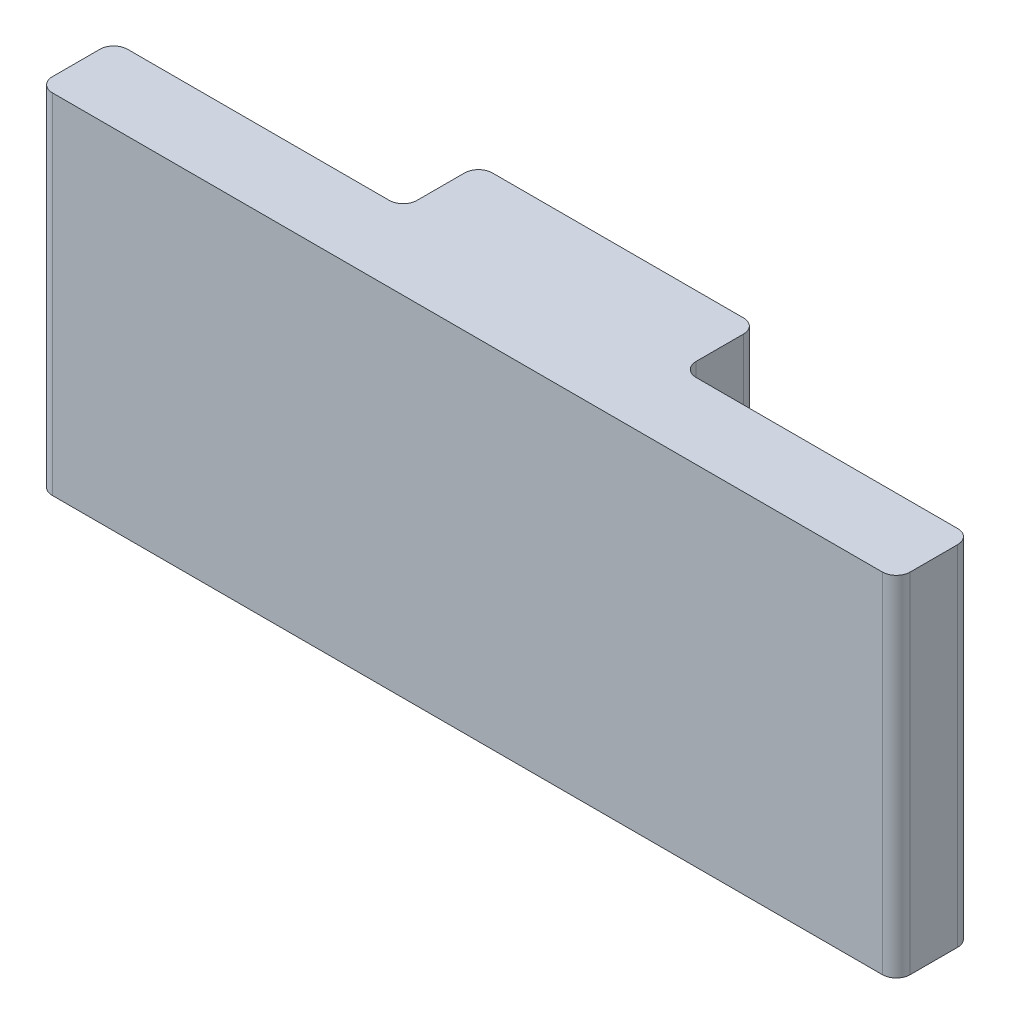
ISO-10303-21;
HEADER;
FILE_DESCRIPTION(('STEP AP214'),'2;1');
FILE_NAME('part.step','',(''),(''),'','','');
FILE_SCHEMA(('AUTOMOTIVE_DESIGN { 1 0 10303 214 1 1 1 1 }'));
ENDSEC;
DATA;
#1=APPLICATION_CONTEXT('core data for automotive mechanical design processes');
#2=APPLICATION_PROTOCOL_DEFINITION('international standard','automotive_design',2000,#1);
#3=PRODUCT_CONTEXT('',#1,'mechanical');
#4=PRODUCT('Part','Part','',(#3));
#5=PRODUCT_RELATED_PRODUCT_CATEGORY('part','',(#4));
#6=PRODUCT_DEFINITION_FORMATION('','',#4);
#7=PRODUCT_DEFINITION_CONTEXT('part definition',#1,'design');
#8=PRODUCT_DEFINITION('design','',#6,#7);
#9=PRODUCT_DEFINITION_SHAPE('','',#8);
#10=(LENGTH_UNIT() NAMED_UNIT(*) SI_UNIT(.MILLI.,.METRE.));
#11=(NAMED_UNIT(*) PLANE_ANGLE_UNIT() SI_UNIT($,.RADIAN.));
#12=(NAMED_UNIT(*) SI_UNIT($,.STERADIAN.) SOLID_ANGLE_UNIT());
#13=UNCERTAINTY_MEASURE_WITH_UNIT(LENGTH_MEASURE(1.E-05),#10,'distance_accuracy_value','');
#14=(GEOMETRIC_REPRESENTATION_CONTEXT(3) GLOBAL_UNCERTAINTY_ASSIGNED_CONTEXT((#13)) GLOBAL_UNIT_ASSIGNED_CONTEXT((#10,
#11,#12)) REPRESENTATION_CONTEXT('',''));
#15=CARTESIAN_POINT('',(0.,0.,0.));
#16=DIRECTION('',(0.,0.,1.));
#17=DIRECTION('',(1.,0.,0.));
#18=AXIS2_PLACEMENT_3D('',#15,#16,#17);
#19=CARTESIAN_POINT('',(297.5,250.,-10.));
#20=DIRECTION('',(0.,-1.,0.));
#21=DIRECTION('',(0.,0.,-1.));
#22=AXIS2_PLACEMENT_3D('',#19,#20,#21);
#23=CYLINDRICAL_SURFACE('',#22,10.);
#24=CARTESIAN_POINT('',(297.5,0.,-10.));
#25=DIRECTION('',(0.,1.,0.));
#26=DIRECTION('',(0.,0.,1.));
#27=AXIS2_PLACEMENT_3D('',#24,#25,#26);
#28=CIRCLE('',#27,10.);
#29=CARTESIAN_POINT('',(297.5,0.,0.));
#30=VERTEX_POINT('',#29);
#31=CARTESIAN_POINT('',(307.5,0.,-10.0000000000001));
#32=VERTEX_POINT('',#31);
#33=EDGE_CURVE('E181',#30,#32,#28,.T.);
#34=ORIENTED_EDGE('',*,*,#33,.T.);
#35=DIRECTION('',(0.,-1.,0.));
#36=VECTOR('',#35,1.);
#37=CARTESIAN_POINT('',(307.5,250.,-10.0000000000001));
#38=LINE('',#37,#36);
#39=CARTESIAN_POINT('',(307.5,250.,-10.0000000000001));
#40=VERTEX_POINT('',#39);
#41=EDGE_CURVE('E11',#40,#32,#38,.T.);
#42=ORIENTED_EDGE('',*,*,#41,.F.);
#43=CARTESIAN_POINT('',(297.5,250.,-10.));
#44=DIRECTION('',(0.,1.,0.));
#45=DIRECTION('',(0.,0.,1.));
#46=AXIS2_PLACEMENT_3D('',#43,#44,#45);
#47=CIRCLE('',#46,10.);
#48=CARTESIAN_POINT('',(297.5,250.,0.));
#49=VERTEX_POINT('',#48);
#50=EDGE_CURVE('E211',#49,#40,#47,.T.);
#51=ORIENTED_EDGE('',*,*,#50,.F.);
#52=DIRECTION('',(0.,-1.,0.));
#53=VECTOR('',#52,1.);
#54=CARTESIAN_POINT('',(297.5,250.,0.));
#55=LINE('',#54,#53);
#56=EDGE_CURVE('E177',#49,#30,#55,.T.);
#57=ORIENTED_EDGE('',*,*,#56,.T.);
#58=EDGE_LOOP('',(#34,#42,#51,#57));
#59=FACE_BOUND('',#58,.T.);
#60=ADVANCED_FACE('F37',(#59),#23,.T.);
#61=CARTESIAN_POINT('',(307.5,250.,-10.0000000000001));
#62=DIRECTION('',(-1.,0.,0.));
#63=DIRECTION('',(0.,0.,1.));
#64=AXIS2_PLACEMENT_3D('',#61,#62,#63);
#65=PLANE('',#64);
#66=DIRECTION('',(0.,0.,-1.));
#67=VECTOR('',#66,1.);
#68=CARTESIAN_POINT('',(307.5,0.,-10.0000000000001));
#69=LINE('',#68,#67);
#70=CARTESIAN_POINT('',(307.5,0.,-43.9999999999999));
#71=VERTEX_POINT('',#70);
#72=EDGE_CURVE('E184',#32,#71,#69,.T.);
#73=ORIENTED_EDGE('',*,*,#72,.T.);
#74=DIRECTION('',(0.,-1.,0.));
#75=VECTOR('',#74,1.);
#76=CARTESIAN_POINT('',(307.5,250.,-43.9999999999999));
#77=LINE('',#76,#75);
#78=CARTESIAN_POINT('',(307.5,250.,-43.9999999999999));
#79=VERTEX_POINT('',#78);
#80=EDGE_CURVE('E45',#79,#71,#77,.T.);
#81=ORIENTED_EDGE('',*,*,#80,.F.);
#82=DIRECTION('',(0.,0.,-1.));
#83=VECTOR('',#82,1.);
#84=CARTESIAN_POINT('',(307.5,250.,-10.0000000000001));
#85=LINE('',#84,#83);
#86=EDGE_CURVE('E120',#40,#79,#85,.T.);
#87=ORIENTED_EDGE('',*,*,#86,.F.);
#88=ORIENTED_EDGE('',*,*,#41,.T.);
#89=EDGE_LOOP('',(#73,#81,#87,#88));
#90=FACE_BOUND('',#89,.T.);
#91=ADVANCED_FACE('F309',(#90),#65,.F.);
#92=CARTESIAN_POINT('',(297.5,250.,-44.));
#93=DIRECTION('',(0.,-1.,0.));
#94=DIRECTION('',(0.,0.,-1.));
#95=AXIS2_PLACEMENT_3D('',#92,#93,#94);
#96=CYLINDRICAL_SURFACE('',#95,10.);
#97=CARTESIAN_POINT('',(297.5,0.,-44.));
#98=DIRECTION('',(0.,1.,0.));
#99=DIRECTION('',(0.,0.,1.));
#100=AXIS2_PLACEMENT_3D('',#97,#98,#99);
#101=CIRCLE('',#100,10.);
#102=CARTESIAN_POINT('',(297.5,0.,-54.));
#103=VERTEX_POINT('',#102);
#104=EDGE_CURVE('E186',#71,#103,#101,.T.);
#105=ORIENTED_EDGE('',*,*,#104,.T.);
#106=DIRECTION('',(0.,-1.,0.));
#107=VECTOR('',#106,1.);
#108=CARTESIAN_POINT('',(297.5,250.,-54.));
#109=LINE('',#108,#107);
#110=CARTESIAN_POINT('',(297.5,250.,-54.));
#111=VERTEX_POINT('',#110);
#112=EDGE_CURVE('E242',#111,#103,#109,.T.);
#113=ORIENTED_EDGE('',*,*,#112,.F.);
#114=CARTESIAN_POINT('',(297.5,250.,-44.));
#115=DIRECTION('',(0.,1.,0.));
#116=DIRECTION('',(0.,0.,1.));
#117=AXIS2_PLACEMENT_3D('',#114,#115,#116);
#118=CIRCLE('',#117,10.);
#119=EDGE_CURVE('E250',#79,#111,#118,.T.);
#120=ORIENTED_EDGE('',*,*,#119,.F.);
#121=ORIENTED_EDGE('',*,*,#80,.T.);
#122=EDGE_LOOP('',(#105,#113,#120,#121));
#123=FACE_BOUND('',#122,.T.);
#124=ADVANCED_FACE('F248',(#123),#96,.T.);
#125=CARTESIAN_POINT('',(110.,250.,-54.));
#126=DIRECTION('',(0.,0.,1.));
#127=DIRECTION('',(1.,0.,0.));
#128=AXIS2_PLACEMENT_3D('',#125,#126,#127);
#129=PLANE('',#128);
#130=DIRECTION('',(-1.,0.,0.));
#131=VECTOR('',#130,1.);
#132=CARTESIAN_POINT('',(110.,0.,-54.));
#133=LINE('',#132,#131);
#134=CARTESIAN_POINT('',(110.,0.,-54.));
#135=VERTEX_POINT('',#134);
#136=EDGE_CURVE('E188',#103,#135,#133,.T.);
#137=ORIENTED_EDGE('',*,*,#136,.T.);
#138=DIRECTION('',(0.,-1.,0.));
#139=VECTOR('',#138,1.);
#140=CARTESIAN_POINT('',(110.,250.,-54.));
#141=LINE('',#140,#139);
#142=CARTESIAN_POINT('',(110.,250.,-54.));
#143=VERTEX_POINT('',#142);
#144=EDGE_CURVE('E239',#143,#135,#141,.T.);
#145=ORIENTED_EDGE('',*,*,#144,.F.);
#146=DIRECTION('',(-1.,0.,0.));
#147=VECTOR('',#146,1.);
#148=CARTESIAN_POINT('',(110.,250.,-54.));
#149=LINE('',#148,#147);
#150=EDGE_CURVE('E268',#111,#143,#149,.T.);
#151=ORIENTED_EDGE('',*,*,#150,.F.);
#152=ORIENTED_EDGE('',*,*,#112,.T.);
#153=EDGE_LOOP('',(#137,#145,#151,#152));
#154=FACE_BOUND('',#153,.T.);
#155=ADVANCED_FACE('F259',(#154),#129,.F.);
#156=CARTESIAN_POINT('',(110.,250.,-64.));
#157=DIRECTION('',(0.,-1.,0.));
#158=DIRECTION('',(0.,0.,-1.));
#159=AXIS2_PLACEMENT_3D('',#156,#157,#158);
#160=CYLINDRICAL_SURFACE('',#159,10.);
#161=CARTESIAN_POINT('',(110.,0.,-64.));
#162=DIRECTION('',(0.,-1.,0.));
#163=DIRECTION('',(0.,0.,1.));
#164=AXIS2_PLACEMENT_3D('',#161,#162,#163);
#165=CIRCLE('',#164,10.);
#166=CARTESIAN_POINT('',(100.,0.,-64.0000000000001));
#167=VERTEX_POINT('',#166);
#168=EDGE_CURVE('E190',#135,#167,#165,.T.);
#169=ORIENTED_EDGE('',*,*,#168,.T.);
#170=DIRECTION('',(0.,-1.,0.));
#171=VECTOR('',#170,1.);
#172=CARTESIAN_POINT('',(100.,250.,-64.0000000000001));
#173=LINE('',#172,#171);
#174=CARTESIAN_POINT('',(100.,250.,-64.0000000000001));
#175=VERTEX_POINT('',#174);
#176=EDGE_CURVE('E236',#175,#167,#173,.T.);
#177=ORIENTED_EDGE('',*,*,#176,.F.);
#178=CARTESIAN_POINT('',(110.,250.,-64.));
#179=DIRECTION('',(0.,-1.,0.));
#180=DIRECTION('',(0.,0.,1.));
#181=AXIS2_PLACEMENT_3D('',#178,#179,#180);
#182=CIRCLE('',#181,10.);
#183=EDGE_CURVE('E265',#143,#175,#182,.T.);
#184=ORIENTED_EDGE('',*,*,#183,.F.);
#185=ORIENTED_EDGE('',*,*,#144,.T.);
#186=EDGE_LOOP('',(#169,#177,#184,#185));
#187=FACE_BOUND('',#186,.T.);
#188=ADVANCED_FACE('F263',(#187),#160,.F.);
#189=CARTESIAN_POINT('',(100.,250.,-97.9999999999999));
#190=DIRECTION('',(-1.,0.,0.));
#191=DIRECTION('',(0.,0.,1.));
#192=AXIS2_PLACEMENT_3D('',#189,#190,#191);
#193=PLANE('',#192);
#194=DIRECTION('',(0.,0.,-1.));
#195=VECTOR('',#194,1.);
#196=CARTESIAN_POINT('',(100.,0.,-97.9999999999999));
#197=LINE('',#196,#195);
#198=CARTESIAN_POINT('',(100.,0.,-97.9999999999999));
#199=VERTEX_POINT('',#198);
#200=EDGE_CURVE('E192',#167,#199,#197,.T.);
#201=ORIENTED_EDGE('',*,*,#200,.T.);
#202=DIRECTION('',(0.,-1.,0.));
#203=VECTOR('',#202,1.);
#204=CARTESIAN_POINT('',(100.,250.,-97.9999999999999));
#205=LINE('',#204,#203);
#206=CARTESIAN_POINT('',(100.,250.,-97.9999999999999));
#207=VERTEX_POINT('',#206);
#208=EDGE_CURVE('E233',#207,#199,#205,.T.);
#209=ORIENTED_EDGE('',*,*,#208,.F.);
#210=DIRECTION('',(0.,0.,-1.));
#211=VECTOR('',#210,1.);
#212=CARTESIAN_POINT('',(100.,250.,-97.9999999999999));
#213=LINE('',#212,#211);
#214=EDGE_CURVE('E267',#175,#207,#213,.T.);
#215=ORIENTED_EDGE('',*,*,#214,.F.);
#216=ORIENTED_EDGE('',*,*,#176,.T.);
#217=EDGE_LOOP('',(#201,#209,#215,#216));
#218=FACE_BOUND('',#217,.T.);
#219=ADVANCED_FACE('F322',(#218),#193,.F.);
#220=CARTESIAN_POINT('',(90.,250.,-98.));
#221=DIRECTION('',(0.,-1.,0.));
#222=DIRECTION('',(0.,0.,-1.));
#223=AXIS2_PLACEMENT_3D('',#220,#221,#222);
#224=CYLINDRICAL_SURFACE('',#223,9.99999999999999);
#225=CARTESIAN_POINT('',(90.,0.,-98.));
#226=DIRECTION('',(0.,1.,0.));
#227=DIRECTION('',(0.,0.,-1.));
#228=AXIS2_PLACEMENT_3D('',#225,#226,#227);
#229=CIRCLE('',#228,9.99999999999999);
#230=CARTESIAN_POINT('',(89.9999999999999,0.,-108.));
#231=VERTEX_POINT('',#230);
#232=EDGE_CURVE('E194',#199,#231,#229,.T.);
#233=ORIENTED_EDGE('',*,*,#232,.T.);
#234=DIRECTION('',(0.,-1.,0.));
#235=VECTOR('',#234,1.);
#236=CARTESIAN_POINT('',(89.9999999999999,250.,-108.));
#237=LINE('',#236,#235);
#238=CARTESIAN_POINT('',(89.9999999999999,250.,-108.));
#239=VERTEX_POINT('',#238);
#240=EDGE_CURVE('E230',#239,#231,#237,.T.);
#241=ORIENTED_EDGE('',*,*,#240,.F.);
#242=CARTESIAN_POINT('',(90.,250.,-98.));
#243=DIRECTION('',(0.,1.,0.));
#244=DIRECTION('',(0.,0.,-1.));
#245=AXIS2_PLACEMENT_3D('',#242,#243,#244);
#246=CIRCLE('',#245,9.99999999999999);
#247=EDGE_CURVE('E270',#207,#239,#246,.T.);
#248=ORIENTED_EDGE('',*,*,#247,.F.);
#249=ORIENTED_EDGE('',*,*,#208,.T.);
#250=EDGE_LOOP('',(#233,#241,#248,#249));
#251=FACE_BOUND('',#250,.T.);
#252=ADVANCED_FACE('F325',(#251),#224,.T.);
#253=CARTESIAN_POINT('',(-89.9999999999999,250.,-108.));
#254=DIRECTION('',(0.,0.,1.));
#255=DIRECTION('',(1.,0.,0.));
#256=AXIS2_PLACEMENT_3D('',#253,#254,#255);
#257=PLANE('',#256);
#258=DIRECTION('',(-1.,0.,0.));
#259=VECTOR('',#258,1.);
#260=CARTESIAN_POINT('',(-89.9999999999999,0.,-108.));
#261=LINE('',#260,#259);
#262=CARTESIAN_POINT('',(-89.9999999999999,0.,-108.));
#263=VERTEX_POINT('',#262);
#264=EDGE_CURVE('E196',#231,#263,#261,.T.);
#265=ORIENTED_EDGE('',*,*,#264,.T.);
#266=DIRECTION('',(0.,-1.,0.));
#267=VECTOR('',#266,1.);
#268=CARTESIAN_POINT('',(-89.9999999999999,250.,-108.));
#269=LINE('',#268,#267);
#270=CARTESIAN_POINT('',(-89.9999999999999,250.,-108.));
#271=VERTEX_POINT('',#270);
#272=EDGE_CURVE('E227',#271,#263,#269,.T.);
#273=ORIENTED_EDGE('',*,*,#272,.F.);
#274=DIRECTION('',(-1.,0.,0.));
#275=VECTOR('',#274,1.);
#276=CARTESIAN_POINT('',(-89.9999999999999,250.,-108.));
#277=LINE('',#276,#275);
#278=EDGE_CURVE('E276',#239,#271,#277,.T.);
#279=ORIENTED_EDGE('',*,*,#278,.F.);
#280=ORIENTED_EDGE('',*,*,#240,.T.);
#281=EDGE_LOOP('',(#265,#273,#279,#280));
#282=FACE_BOUND('',#281,.T.);
#283=ADVANCED_FACE('F329',(#282),#257,.F.);
#284=CARTESIAN_POINT('',(-90.,250.,-98.));
#285=DIRECTION('',(0.,-1.,0.));
#286=DIRECTION('',(0.,0.,-1.));
#287=AXIS2_PLACEMENT_3D('',#284,#285,#286);
#288=CYLINDRICAL_SURFACE('',#287,9.99999999999999);
#289=CARTESIAN_POINT('',(-90.,0.,-98.));
#290=DIRECTION('',(0.,1.,0.));
#291=DIRECTION('',(0.,0.,1.));
#292=AXIS2_PLACEMENT_3D('',#289,#290,#291);
#293=CIRCLE('',#292,9.99999999999999);
#294=CARTESIAN_POINT('',(-100.,0.,-97.9999999999999));
#295=VERTEX_POINT('',#294);
#296=EDGE_CURVE('E198',#263,#295,#293,.T.);
#297=ORIENTED_EDGE('',*,*,#296,.T.);
#298=DIRECTION('',(0.,-1.,0.));
#299=VECTOR('',#298,1.);
#300=CARTESIAN_POINT('',(-100.,250.,-97.9999999999999));
#301=LINE('',#300,#299);
#302=CARTESIAN_POINT('',(-100.,250.,-97.9999999999999));
#303=VERTEX_POINT('',#302);
#304=EDGE_CURVE('E224',#303,#295,#301,.T.);
#305=ORIENTED_EDGE('',*,*,#304,.F.);
#306=CARTESIAN_POINT('',(-90.,250.,-98.));
#307=DIRECTION('',(0.,1.,0.));
#308=DIRECTION('',(0.,0.,1.));
#309=AXIS2_PLACEMENT_3D('',#306,#307,#308);
#310=CIRCLE('',#309,9.99999999999999);
#311=EDGE_CURVE('E278',#271,#303,#310,.T.);
#312=ORIENTED_EDGE('',*,*,#311,.F.);
#313=ORIENTED_EDGE('',*,*,#272,.T.);
#314=EDGE_LOOP('',(#297,#305,#312,#313));
#315=FACE_BOUND('',#314,.T.);
#316=ADVANCED_FACE('F333',(#315),#288,.T.);
#317=CARTESIAN_POINT('',(-100.,250.,-97.9999999999999));
#318=DIRECTION('',(1.,0.,0.));
#319=DIRECTION('',(0.,0.,-1.));
#320=AXIS2_PLACEMENT_3D('',#317,#318,#319);
#321=PLANE('',#320);
#322=DIRECTION('',(0.,0.,1.));
#323=VECTOR('',#322,1.);
#324=CARTESIAN_POINT('',(-100.,0.,-97.9999999999999));
#325=LINE('',#324,#323);
#326=CARTESIAN_POINT('',(-100.,0.,-64.0000000000001));
#327=VERTEX_POINT('',#326);
#328=EDGE_CURVE('E200',#295,#327,#325,.T.);
#329=ORIENTED_EDGE('',*,*,#328,.T.);
#330=DIRECTION('',(0.,-1.,0.));
#331=VECTOR('',#330,1.);
#332=CARTESIAN_POINT('',(-100.,250.,-64.0000000000001));
#333=LINE('',#332,#331);
#334=CARTESIAN_POINT('',(-100.,250.,-64.0000000000001));
#335=VERTEX_POINT('',#334);
#336=EDGE_CURVE('E221',#335,#327,#333,.T.);
#337=ORIENTED_EDGE('',*,*,#336,.F.);
#338=DIRECTION('',(0.,0.,1.));
#339=VECTOR('',#338,1.);
#340=CARTESIAN_POINT('',(-100.,250.,-97.9999999999999));
#341=LINE('',#340,#339);
#342=EDGE_CURVE('E280',#303,#335,#341,.T.);
#343=ORIENTED_EDGE('',*,*,#342,.F.);
#344=ORIENTED_EDGE('',*,*,#304,.T.);
#345=EDGE_LOOP('',(#329,#337,#343,#344));
#346=FACE_BOUND('',#345,.T.);
#347=ADVANCED_FACE('F337',(#346),#321,.F.);
#348=CARTESIAN_POINT('',(-110.,250.,-64.));
#349=DIRECTION('',(0.,-1.,0.));
#350=DIRECTION('',(0.,0.,-1.));
#351=AXIS2_PLACEMENT_3D('',#348,#349,#350);
#352=CYLINDRICAL_SURFACE('',#351,10.);
#353=CARTESIAN_POINT('',(-110.,0.,-64.));
#354=DIRECTION('',(0.,-1.,0.));
#355=DIRECTION('',(0.,0.,-1.));
#356=AXIS2_PLACEMENT_3D('',#353,#354,#355);
#357=CIRCLE('',#356,10.);
#358=CARTESIAN_POINT('',(-110.,0.,-54.));
#359=VERTEX_POINT('',#358);
#360=EDGE_CURVE('E202',#327,#359,#357,.T.);
#361=ORIENTED_EDGE('',*,*,#360,.T.);
#362=DIRECTION('',(0.,-1.,0.));
#363=VECTOR('',#362,1.);
#364=CARTESIAN_POINT('',(-110.,250.,-54.));
#365=LINE('',#364,#363);
#366=CARTESIAN_POINT('',(-110.,250.,-54.));
#367=VERTEX_POINT('',#366);
#368=EDGE_CURVE('E218',#367,#359,#365,.T.);
#369=ORIENTED_EDGE('',*,*,#368,.F.);
#370=CARTESIAN_POINT('',(-110.,250.,-64.));
#371=DIRECTION('',(0.,-1.,0.));
#372=DIRECTION('',(0.,0.,-1.));
#373=AXIS2_PLACEMENT_3D('',#370,#371,#372);
#374=CIRCLE('',#373,10.);
#375=EDGE_CURVE('E282',#335,#367,#374,.T.);
#376=ORIENTED_EDGE('',*,*,#375,.F.);
#377=ORIENTED_EDGE('',*,*,#336,.T.);
#378=EDGE_LOOP('',(#361,#369,#376,#377));
#379=FACE_BOUND('',#378,.T.);
#380=ADVANCED_FACE('F341',(#379),#352,.F.);
#381=CARTESIAN_POINT('',(-110.,250.,-54.));
#382=DIRECTION('',(0.,0.,1.));
#383=DIRECTION('',(1.,0.,0.));
#384=AXIS2_PLACEMENT_3D('',#381,#382,#383);
#385=PLANE('',#384);
#386=DIRECTION('',(-1.,0.,0.));
#387=VECTOR('',#386,1.);
#388=CARTESIAN_POINT('',(-110.,0.,-54.));
#389=LINE('',#388,#387);
#390=CARTESIAN_POINT('',(-297.5,0.,-54.));
#391=VERTEX_POINT('',#390);
#392=EDGE_CURVE('E204',#359,#391,#389,.T.);
#393=ORIENTED_EDGE('',*,*,#392,.T.);
#394=DIRECTION('',(0.,-1.,0.));
#395=VECTOR('',#394,1.);
#396=CARTESIAN_POINT('',(-297.5,250.,-54.));
#397=LINE('',#396,#395);
#398=CARTESIAN_POINT('',(-297.5,250.,-54.));
#399=VERTEX_POINT('',#398);
#400=EDGE_CURVE('E215',#399,#391,#397,.T.);
#401=ORIENTED_EDGE('',*,*,#400,.F.);
#402=DIRECTION('',(-1.,0.,0.));
#403=VECTOR('',#402,1.);
#404=CARTESIAN_POINT('',(-110.,250.,-54.));
#405=LINE('',#404,#403);
#406=EDGE_CURVE('E284',#367,#399,#405,.T.);
#407=ORIENTED_EDGE('',*,*,#406,.F.);
#408=ORIENTED_EDGE('',*,*,#368,.T.);
#409=EDGE_LOOP('',(#393,#401,#407,#408));
#410=FACE_BOUND('',#409,.T.);
#411=ADVANCED_FACE('F290',(#410),#385,.F.);
#412=CARTESIAN_POINT('',(-297.5,250.,-43.9999999999999));
#413=DIRECTION('',(0.,-1.,0.));
#414=DIRECTION('',(0.,0.,-1.));
#415=AXIS2_PLACEMENT_3D('',#412,#413,#414);
#416=CYLINDRICAL_SURFACE('',#415,10.);
#417=CARTESIAN_POINT('',(-297.5,0.,-43.9999999999999));
#418=DIRECTION('',(0.,1.,0.));
#419=DIRECTION('',(0.,0.,-1.));
#420=AXIS2_PLACEMENT_3D('',#417,#418,#419);
#421=CIRCLE('',#420,10.);
#422=CARTESIAN_POINT('',(-307.5,0.,-43.9999999999999));
#423=VERTEX_POINT('',#422);
#424=EDGE_CURVE('E206',#391,#423,#421,.T.);
#425=ORIENTED_EDGE('',*,*,#424,.T.);
#426=DIRECTION('',(0.,-1.,0.));
#427=VECTOR('',#426,1.);
#428=CARTESIAN_POINT('',(-307.5,250.,-43.9999999999999));
#429=LINE('',#428,#427);
#430=CARTESIAN_POINT('',(-307.5,250.,-43.9999999999999));
#431=VERTEX_POINT('',#430);
#432=EDGE_CURVE('E172',#431,#423,#429,.T.);
#433=ORIENTED_EDGE('',*,*,#432,.F.);
#434=CARTESIAN_POINT('',(-297.5,250.,-43.9999999999999));
#435=DIRECTION('',(0.,1.,0.));
#436=DIRECTION('',(0.,0.,-1.));
#437=AXIS2_PLACEMENT_3D('',#434,#435,#436);
#438=CIRCLE('',#437,10.);
#439=EDGE_CURVE('E163',#399,#431,#438,.T.);
#440=ORIENTED_EDGE('',*,*,#439,.F.);
#441=ORIENTED_EDGE('',*,*,#400,.T.);
#442=EDGE_LOOP('',(#425,#433,#440,#441));
#443=FACE_BOUND('',#442,.T.);
#444=ADVANCED_FACE('F294',(#443),#416,.T.);
#445=CARTESIAN_POINT('',(-307.5,250.,-10.));
#446=DIRECTION('',(1.,0.,0.));
#447=DIRECTION('',(0.,0.,-1.));
#448=AXIS2_PLACEMENT_3D('',#445,#446,#447);
#449=PLANE('',#448);
#450=DIRECTION('',(0.,0.,1.));
#451=VECTOR('',#450,1.);
#452=CARTESIAN_POINT('',(-307.5,0.,-10.));
#453=LINE('',#452,#451);
#454=CARTESIAN_POINT('',(-307.5,0.,-10.));
#455=VERTEX_POINT('',#454);
#456=EDGE_CURVE('E171',#423,#455,#453,.T.);
#457=ORIENTED_EDGE('',*,*,#456,.T.);
#458=DIRECTION('',(0.,-1.,0.));
#459=VECTOR('',#458,1.);
#460=CARTESIAN_POINT('',(-307.5,250.,-10.));
#461=LINE('',#460,#459);
#462=CARTESIAN_POINT('',(-307.5,250.,-10.));
#463=VERTEX_POINT('',#462);
#464=EDGE_CURVE('E168',#463,#455,#461,.T.);
#465=ORIENTED_EDGE('',*,*,#464,.F.);
#466=DIRECTION('',(0.,0.,1.));
#467=VECTOR('',#466,1.);
#468=CARTESIAN_POINT('',(-307.5,250.,-10.));
#469=LINE('',#468,#467);
#470=EDGE_CURVE('E157',#431,#463,#469,.T.);
#471=ORIENTED_EDGE('',*,*,#470,.F.);
#472=ORIENTED_EDGE('',*,*,#432,.T.);
#473=EDGE_LOOP('',(#457,#465,#471,#472));
#474=FACE_BOUND('',#473,.T.);
#475=ADVANCED_FACE('F169',(#474),#449,.F.);
#476=CARTESIAN_POINT('',(-297.5,250.,-9.99999999999994));
#477=DIRECTION('',(0.,-1.,0.));
#478=DIRECTION('',(0.,0.,-1.));
#479=AXIS2_PLACEMENT_3D('',#476,#477,#478);
#480=CYLINDRICAL_SURFACE('',#479,10.);
#481=CARTESIAN_POINT('',(-297.5,0.,-9.99999999999994));
#482=DIRECTION('',(0.,1.,0.));
#483=DIRECTION('',(0.,0.,-1.));
#484=AXIS2_PLACEMENT_3D('',#481,#482,#483);
#485=CIRCLE('',#484,10.);
#486=CARTESIAN_POINT('',(-297.5,0.,0.));
#487=VERTEX_POINT('',#486);
#488=EDGE_CURVE('E106',#455,#487,#485,.T.);
#489=ORIENTED_EDGE('',*,*,#488,.T.);
#490=DIRECTION('',(0.,-1.,0.));
#491=VECTOR('',#490,1.);
#492=CARTESIAN_POINT('',(-297.5,250.,0.));
#493=LINE('',#492,#491);
#494=CARTESIAN_POINT('',(-297.5,250.,0.));
#495=VERTEX_POINT('',#494);
#496=EDGE_CURVE('E173',#495,#487,#493,.T.);
#497=ORIENTED_EDGE('',*,*,#496,.F.);
#498=CARTESIAN_POINT('',(-297.5,250.,-9.99999999999994));
#499=DIRECTION('',(0.,1.,0.));
#500=DIRECTION('',(0.,0.,-1.));
#501=AXIS2_PLACEMENT_3D('',#498,#499,#500);
#502=CIRCLE('',#501,10.);
#503=EDGE_CURVE('E161',#463,#495,#502,.T.);
#504=ORIENTED_EDGE('',*,*,#503,.F.);
#505=ORIENTED_EDGE('',*,*,#464,.T.);
#506=EDGE_LOOP('',(#489,#497,#504,#505));
#507=FACE_BOUND('',#506,.T.);
#508=ADVANCED_FACE('F175',(#507),#480,.T.);
#509=CARTESIAN_POINT('',(-297.5,250.,0.));
#510=DIRECTION('',(0.,0.,-1.));
#511=DIRECTION('',(-1.,0.,0.));
#512=AXIS2_PLACEMENT_3D('',#509,#510,#511);
#513=PLANE('',#512);
#514=DIRECTION('',(1.,0.,0.));
#515=VECTOR('',#514,1.);
#516=CARTESIAN_POINT('',(-297.5,0.,0.));
#517=LINE('',#516,#515);
#518=EDGE_CURVE('E112',#487,#30,#517,.T.);
#519=ORIENTED_EDGE('',*,*,#518,.T.);
#520=ORIENTED_EDGE('',*,*,#56,.F.);
#521=DIRECTION('',(1.,0.,0.));
#522=VECTOR('',#521,1.);
#523=CARTESIAN_POINT('',(-297.5,250.,0.));
#524=LINE('',#523,#522);
#525=EDGE_CURVE('E53',#495,#49,#524,.T.);
#526=ORIENTED_EDGE('',*,*,#525,.F.);
#527=ORIENTED_EDGE('',*,*,#496,.T.);
#528=EDGE_LOOP('',(#519,#520,#526,#527));
#529=FACE_BOUND('',#528,.T.);
#530=ADVANCED_FACE('F298',(#529),#513,.F.);
#531=CARTESIAN_POINT('',(297.5,250.,-10.));
#532=DIRECTION('',(0.,1.,0.));
#533=DIRECTION('',(0.,0.,1.));
#534=AXIS2_PLACEMENT_3D('',#531,#532,#533);
#535=PLANE('',#534);
#536=ORIENTED_EDGE('',*,*,#50,.T.);
#537=ORIENTED_EDGE('',*,*,#86,.T.);
#538=ORIENTED_EDGE('',*,*,#119,.T.);
#539=ORIENTED_EDGE('',*,*,#150,.T.);
#540=ORIENTED_EDGE('',*,*,#183,.T.);
#541=ORIENTED_EDGE('',*,*,#214,.T.);
#542=ORIENTED_EDGE('',*,*,#247,.T.);
#543=ORIENTED_EDGE('',*,*,#278,.T.);
#544=ORIENTED_EDGE('',*,*,#311,.T.);
#545=ORIENTED_EDGE('',*,*,#342,.T.);
#546=ORIENTED_EDGE('',*,*,#375,.T.);
#547=ORIENTED_EDGE('',*,*,#406,.T.);
#548=ORIENTED_EDGE('',*,*,#439,.T.);
#549=ORIENTED_EDGE('',*,*,#470,.T.);
#550=ORIENTED_EDGE('',*,*,#503,.T.);
#551=ORIENTED_EDGE('',*,*,#525,.T.);
#552=EDGE_LOOP('',(#536,#537,#538,#539,#540,#541,#542,#543,#544,#545,#546,#547,#548,#549,#550,#551));
#553=FACE_BOUND('',#552,.T.);
#554=ADVANCED_FACE('F159',(#553),#535,.T.);
#555=CARTESIAN_POINT('',(297.5,0.,-10.));
#556=DIRECTION('',(0.,1.,0.));
#557=DIRECTION('',(0.,0.,1.));
#558=AXIS2_PLACEMENT_3D('',#555,#556,#557);
#559=PLANE('',#558);
#560=ORIENTED_EDGE('',*,*,#33,.F.);
#561=ORIENTED_EDGE('',*,*,#518,.F.);
#562=ORIENTED_EDGE('',*,*,#488,.F.);
#563=ORIENTED_EDGE('',*,*,#456,.F.);
#564=ORIENTED_EDGE('',*,*,#424,.F.);
#565=ORIENTED_EDGE('',*,*,#392,.F.);
#566=ORIENTED_EDGE('',*,*,#360,.F.);
#567=ORIENTED_EDGE('',*,*,#328,.F.);
#568=ORIENTED_EDGE('',*,*,#296,.F.);
#569=ORIENTED_EDGE('',*,*,#264,.F.);
#570=ORIENTED_EDGE('',*,*,#232,.F.);
#571=ORIENTED_EDGE('',*,*,#200,.F.);
#572=ORIENTED_EDGE('',*,*,#168,.F.);
#573=ORIENTED_EDGE('',*,*,#136,.F.);
#574=ORIENTED_EDGE('',*,*,#104,.F.);
#575=ORIENTED_EDGE('',*,*,#72,.F.);
#576=EDGE_LOOP('',(#560,#561,#562,#563,#564,#565,#566,#567,#568,#569,#570,#571,#572,#573,#574,#575));
#577=FACE_BOUND('',#576,.T.);
#578=ADVANCED_FACE('F254',(#577),#559,.F.);
#579=CLOSED_SHELL('',(#60,#91,#124,#155,#188,#219,#252,#283,#316,#347,#380,#411,#444,#475,#508,
#530,#554,#578));
#580=MANIFOLD_SOLID_BREP('B2',#579);
#581=ADVANCED_BREP_SHAPE_REPRESENTATION('',(#18,#580),#14);
#582=SHAPE_DEFINITION_REPRESENTATION(#9,#581);
ENDSEC;
END-ISO-10303-21;
